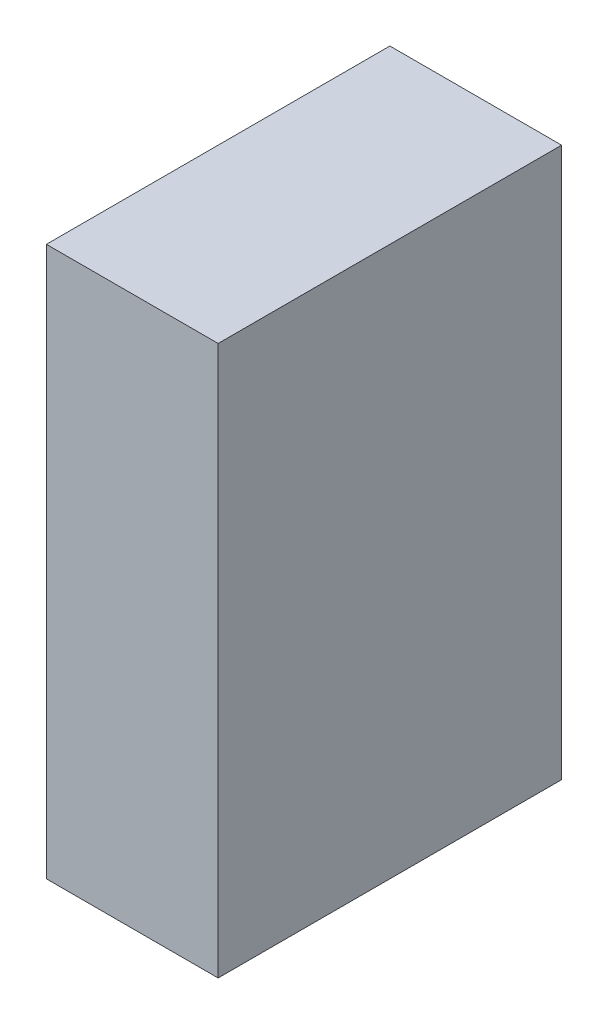
ISO-10303-21;
HEADER;
FILE_DESCRIPTION(('STEP AP214'),'2;1');
FILE_NAME('part.step','',(''),(''),'','','');
FILE_SCHEMA(('AUTOMOTIVE_DESIGN { 1 0 10303 214 1 1 1 1 }'));
ENDSEC;
DATA;
#1=APPLICATION_CONTEXT('core data for automotive mechanical design processes');
#2=APPLICATION_PROTOCOL_DEFINITION('international standard','automotive_design',2000,#1);
#3=PRODUCT_CONTEXT('',#1,'mechanical');
#4=PRODUCT('Part','Part','',(#3));
#5=PRODUCT_RELATED_PRODUCT_CATEGORY('part','',(#4));
#6=PRODUCT_DEFINITION_FORMATION('','',#4);
#7=PRODUCT_DEFINITION_CONTEXT('part definition',#1,'design');
#8=PRODUCT_DEFINITION('design','',#6,#7);
#9=PRODUCT_DEFINITION_SHAPE('','',#8);
#10=(LENGTH_UNIT() NAMED_UNIT(*) SI_UNIT(.MILLI.,.METRE.));
#11=(NAMED_UNIT(*) PLANE_ANGLE_UNIT() SI_UNIT($,.RADIAN.));
#12=(NAMED_UNIT(*) SI_UNIT($,.STERADIAN.) SOLID_ANGLE_UNIT());
#13=UNCERTAINTY_MEASURE_WITH_UNIT(LENGTH_MEASURE(1.E-05),#10,'distance_accuracy_value','');
#14=(GEOMETRIC_REPRESENTATION_CONTEXT(3) GLOBAL_UNCERTAINTY_ASSIGNED_CONTEXT((#13)) GLOBAL_UNIT_ASSIGNED_CONTEXT((#10,
#11,#12)) REPRESENTATION_CONTEXT('',''));
#15=CARTESIAN_POINT('',(0.,0.,0.));
#16=DIRECTION('',(0.,0.,1.));
#17=DIRECTION('',(1.,0.,0.));
#18=AXIS2_PLACEMENT_3D('',#15,#16,#17);
#19=CARTESIAN_POINT('',(-0.2499995,0.80000094,0.));
#20=DIRECTION('',(1.,0.,0.));
#21=DIRECTION('',(0.,0.,-1.));
#22=AXIS2_PLACEMENT_3D('',#19,#20,#21);
#23=PLANE('',#22);
#24=DIRECTION('',(0.,0.,1.));
#25=VECTOR('',#24,1.);
#26=CARTESIAN_POINT('',(-0.2499995,-0.7999984,0.));
#27=LINE('',#26,#25);
#28=CARTESIAN_POINT('',(-0.2499995,-0.7999984,0.));
#29=VERTEX_POINT('',#28);
#30=CARTESIAN_POINT('',(-0.2499995,-0.7999984,1.00000054));
#31=VERTEX_POINT('',#30);
#32=EDGE_CURVE('E17',#29,#31,#27,.T.);
#33=ORIENTED_EDGE('',*,*,#32,.T.);
#34=DIRECTION('',(0.,1.,0.));
#35=VECTOR('',#34,1.);
#36=CARTESIAN_POINT('',(-0.2499995,-0.7999984,1.00000054));
#37=LINE('',#36,#35);
#38=CARTESIAN_POINT('',(-0.2499995,0.80000094,1.00000054));
#39=VERTEX_POINT('',#38);
#40=EDGE_CURVE('E52',#31,#39,#37,.T.);
#41=ORIENTED_EDGE('',*,*,#40,.T.);
#42=DIRECTION('',(0.,0.,-1.));
#43=VECTOR('',#42,1.);
#44=CARTESIAN_POINT('',(-0.2499995,0.80000094,0.));
#45=LINE('',#44,#43);
#46=CARTESIAN_POINT('',(-0.2499995,0.80000094,0.));
#47=VERTEX_POINT('',#46);
#48=EDGE_CURVE('E73',#39,#47,#45,.T.);
#49=ORIENTED_EDGE('',*,*,#48,.T.);
#50=DIRECTION('',(0.,1.,0.));
#51=VECTOR('',#50,1.);
#52=CARTESIAN_POINT('',(-0.2499995,-0.7999984,0.));
#53=LINE('',#52,#51);
#54=EDGE_CURVE('E55',#29,#47,#53,.T.);
#55=ORIENTED_EDGE('',*,*,#54,.F.);
#56=EDGE_LOOP('',(#33,#41,#49,#55));
#57=FACE_BOUND('',#56,.T.);
#58=ADVANCED_FACE('F14',(#57),#23,.F.);
#59=CARTESIAN_POINT('',(-0.2499995,-0.7999984,0.));
#60=DIRECTION('',(0.,1.,0.));
#61=DIRECTION('',(0.,0.,1.));
#62=AXIS2_PLACEMENT_3D('',#59,#60,#61);
#63=PLANE('',#62);
#64=DIRECTION('',(0.,0.,1.));
#65=VECTOR('',#64,1.);
#66=CARTESIAN_POINT('',(0.2499995,-0.7999984,0.));
#67=LINE('',#66,#65);
#68=CARTESIAN_POINT('',(0.2499995,-0.7999984,0.));
#69=VERTEX_POINT('',#68);
#70=CARTESIAN_POINT('',(0.2499995,-0.7999984,1.00000054));
#71=VERTEX_POINT('',#70);
#72=EDGE_CURVE('E70',#69,#71,#67,.T.);
#73=ORIENTED_EDGE('',*,*,#72,.T.);
#74=DIRECTION('',(-1.,0.,0.));
#75=VECTOR('',#74,1.);
#76=CARTESIAN_POINT('',(0.2499995,-0.7999984,1.00000054));
#77=LINE('',#76,#75);
#78=EDGE_CURVE('E60',#71,#31,#77,.T.);
#79=ORIENTED_EDGE('',*,*,#78,.T.);
#80=ORIENTED_EDGE('',*,*,#32,.F.);
#81=DIRECTION('',(-1.,0.,0.));
#82=VECTOR('',#81,1.);
#83=CARTESIAN_POINT('',(0.2499995,-0.7999984,0.));
#84=LINE('',#83,#82);
#85=EDGE_CURVE('E75',#69,#29,#84,.T.);
#86=ORIENTED_EDGE('',*,*,#85,.F.);
#87=EDGE_LOOP('',(#73,#79,#80,#86));
#88=FACE_BOUND('',#87,.T.);
#89=ADVANCED_FACE('F69',(#88),#63,.F.);
#90=CARTESIAN_POINT('',(0.2499995,-0.7999984,1.00000054));
#91=DIRECTION('',(0.,0.,-1.));
#92=DIRECTION('',(-1.,0.,0.));
#93=AXIS2_PLACEMENT_3D('',#90,#91,#92);
#94=PLANE('',#93);
#95=DIRECTION('',(1.,0.,0.));
#96=VECTOR('',#95,1.);
#97=CARTESIAN_POINT('',(0.2499995,0.80000094,1.00000054));
#98=LINE('',#97,#96);
#99=CARTESIAN_POINT('',(0.2499995,0.80000094,1.00000054));
#100=VERTEX_POINT('',#99);
#101=EDGE_CURVE('E66',#100,#39,#98,.F.);
#102=ORIENTED_EDGE('',*,*,#101,.T.);
#103=ORIENTED_EDGE('',*,*,#40,.F.);
#104=ORIENTED_EDGE('',*,*,#78,.F.);
#105=DIRECTION('',(0.,1.,0.));
#106=VECTOR('',#105,1.);
#107=CARTESIAN_POINT('',(0.2499995,-0.7999984,1.00000054));
#108=LINE('',#107,#106);
#109=EDGE_CURVE('E80',#71,#100,#108,.T.);
#110=ORIENTED_EDGE('',*,*,#109,.T.);
#111=EDGE_LOOP('',(#102,#103,#104,#110));
#112=FACE_BOUND('',#111,.T.);
#113=ADVANCED_FACE('F63',(#112),#94,.F.);
#114=CARTESIAN_POINT('',(0.2499995,0.80000094,0.));
#115=DIRECTION('',(0.,-1.,0.));
#116=DIRECTION('',(0.,0.,-1.));
#117=AXIS2_PLACEMENT_3D('',#114,#115,#116);
#118=PLANE('',#117);
#119=ORIENTED_EDGE('',*,*,#48,.F.);
#120=ORIENTED_EDGE('',*,*,#101,.F.);
#121=DIRECTION('',(0.,0.,1.));
#122=VECTOR('',#121,1.);
#123=CARTESIAN_POINT('',(0.2499995,0.80000094,0.));
#124=LINE('',#123,#122);
#125=CARTESIAN_POINT('',(0.2499995,0.80000094,0.));
#126=VERTEX_POINT('',#125);
#127=EDGE_CURVE('E23',#100,#126,#124,.F.);
#128=ORIENTED_EDGE('',*,*,#127,.T.);
#129=DIRECTION('',(-1.,0.,0.));
#130=VECTOR('',#129,1.);
#131=CARTESIAN_POINT('',(0.2499995,0.80000094,0.));
#132=LINE('',#131,#130);
#133=EDGE_CURVE('E31',#47,#126,#132,.F.);
#134=ORIENTED_EDGE('',*,*,#133,.F.);
#135=EDGE_LOOP('',(#119,#120,#128,#134));
#136=FACE_BOUND('',#135,.T.);
#137=ADVANCED_FACE('F85',(#136),#118,.F.);
#138=CARTESIAN_POINT('',(0.2499995,-0.7999984,0.));
#139=DIRECTION('',(0.,0.,-1.));
#140=DIRECTION('',(-1.,0.,0.));
#141=AXIS2_PLACEMENT_3D('',#138,#139,#140);
#142=PLANE('',#141);
#143=ORIENTED_EDGE('',*,*,#133,.T.);
#144=DIRECTION('',(0.,1.,0.));
#145=VECTOR('',#144,1.);
#146=CARTESIAN_POINT('',(0.2499995,-0.7999984,0.));
#147=LINE('',#146,#145);
#148=EDGE_CURVE('E9',#126,#69,#147,.F.);
#149=ORIENTED_EDGE('',*,*,#148,.T.);
#150=ORIENTED_EDGE('',*,*,#85,.T.);
#151=ORIENTED_EDGE('',*,*,#54,.T.);
#152=EDGE_LOOP('',(#143,#149,#150,#151));
#153=FACE_BOUND('',#152,.T.);
#154=ADVANCED_FACE('F88',(#153),#142,.T.);
#155=CARTESIAN_POINT('',(0.2499995,-0.7999984,0.));
#156=DIRECTION('',(-1.,0.,0.));
#157=DIRECTION('',(0.,0.,1.));
#158=AXIS2_PLACEMENT_3D('',#155,#156,#157);
#159=PLANE('',#158);
#160=ORIENTED_EDGE('',*,*,#127,.F.);
#161=ORIENTED_EDGE('',*,*,#109,.F.);
#162=ORIENTED_EDGE('',*,*,#72,.F.);
#163=ORIENTED_EDGE('',*,*,#148,.F.);
#164=EDGE_LOOP('',(#160,#161,#162,#163));
#165=FACE_BOUND('',#164,.T.);
#166=ADVANCED_FACE('F87',(#165),#159,.F.);
#167=CLOSED_SHELL('',(#58,#89,#113,#137,#154,#166));
#168=MANIFOLD_SOLID_BREP('B1',#167);
#169=ADVANCED_BREP_SHAPE_REPRESENTATION('',(#18,#168),#14);
#170=SHAPE_DEFINITION_REPRESENTATION(#9,#169);
ENDSEC;
END-ISO-10303-21;
